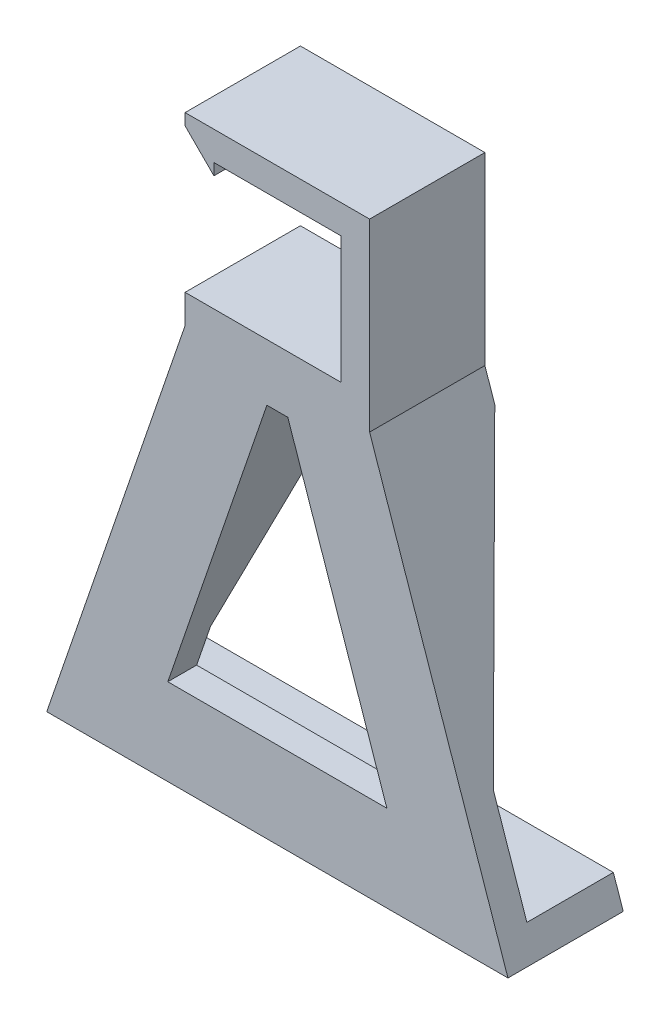
ISO-10303-21;
HEADER;
FILE_DESCRIPTION(('STEP AP214'),'2;1');
FILE_NAME('part.step','',(''),(''),'','','');
FILE_SCHEMA(('AUTOMOTIVE_DESIGN { 1 0 10303 214 1 1 1 1 }'));
ENDSEC;
DATA;
#1=APPLICATION_CONTEXT('core data for automotive mechanical design processes');
#2=APPLICATION_PROTOCOL_DEFINITION('international standard','automotive_design',2000,#1);
#3=PRODUCT_CONTEXT('',#1,'mechanical');
#4=PRODUCT('Part','Part','',(#3));
#5=PRODUCT_RELATED_PRODUCT_CATEGORY('part','',(#4));
#6=PRODUCT_DEFINITION_FORMATION('','',#4);
#7=PRODUCT_DEFINITION_CONTEXT('part definition',#1,'design');
#8=PRODUCT_DEFINITION('design','',#6,#7);
#9=PRODUCT_DEFINITION_SHAPE('','',#8);
#10=(LENGTH_UNIT() NAMED_UNIT(*) SI_UNIT(.MILLI.,.METRE.));
#11=(NAMED_UNIT(*) PLANE_ANGLE_UNIT() SI_UNIT($,.RADIAN.));
#12=(NAMED_UNIT(*) SI_UNIT($,.STERADIAN.) SOLID_ANGLE_UNIT());
#13=UNCERTAINTY_MEASURE_WITH_UNIT(LENGTH_MEASURE(1.E-05),#10,'distance_accuracy_value','');
#14=(GEOMETRIC_REPRESENTATION_CONTEXT(3) GLOBAL_UNCERTAINTY_ASSIGNED_CONTEXT((#13)) GLOBAL_UNIT_ASSIGNED_CONTEXT((#10,
#11,#12)) REPRESENTATION_CONTEXT('',''));
#15=CARTESIAN_POINT('',(0.,0.,0.));
#16=DIRECTION('',(0.,0.,1.));
#17=DIRECTION('',(1.,0.,0.));
#18=AXIS2_PLACEMENT_3D('',#15,#16,#17);
#19=CARTESIAN_POINT('',(0.,0.,20.));
#20=DIRECTION('',(0.,0.,1.));
#21=DIRECTION('',(1.,0.,0.));
#22=AXIS2_PLACEMENT_3D('',#19,#20,#21);
#23=PLANE('',#22);
#24=DIRECTION('',(0.,-1.,0.));
#25=VECTOR('',#24,1.);
#26=CARTESIAN_POINT('',(11.,11.,20.));
#27=LINE('',#26,#25);
#28=CARTESIAN_POINT('',(11.,11.,20.));
#29=VERTEX_POINT('',#28);
#30=CARTESIAN_POINT('',(11.,-11.,20.));
#31=VERTEX_POINT('',#30);
#32=EDGE_CURVE('E375',#29,#31,#27,.T.);
#33=ORIENTED_EDGE('',*,*,#32,.T.);
#34=DIRECTION('',(-1.,0.,0.));
#35=VECTOR('',#34,1.);
#36=CARTESIAN_POINT('',(-11.,-11.,20.));
#37=LINE('',#36,#35);
#38=CARTESIAN_POINT('',(-16.,-11.,20.));
#39=VERTEX_POINT('',#38);
#40=EDGE_CURVE('E383',#31,#39,#37,.T.);
#41=ORIENTED_EDGE('',*,*,#40,.T.);
#42=DIRECTION('',(0.,-1.,0.));
#43=VECTOR('',#42,1.);
#44=CARTESIAN_POINT('',(-16.,-11.,20.));
#45=LINE('',#44,#43);
#46=CARTESIAN_POINT('',(-16.,-16.,20.));
#47=VERTEX_POINT('',#46);
#48=EDGE_CURVE('E386',#39,#47,#45,.T.);
#49=ORIENTED_EDGE('',*,*,#48,.T.);
#50=DIRECTION('',(-0.324324324324324,-0.945945945945946,0.));
#51=VECTOR('',#50,1.);
#52=CARTESIAN_POINT('',(-16.,-16.,20.));
#53=LINE('',#52,#51);
#54=CARTESIAN_POINT('',(-40.,-86.,20.));
#55=VERTEX_POINT('',#54);
#56=EDGE_CURVE('E258',#47,#55,#53,.T.);
#57=ORIENTED_EDGE('',*,*,#56,.T.);
#58=DIRECTION('',(-1.,0.,0.));
#59=VECTOR('',#58,1.);
#60=CARTESIAN_POINT('',(-40.,-86.,20.));
#61=LINE('',#60,#59);
#62=CARTESIAN_POINT('',(40.,-86.,20.));
#63=VERTEX_POINT('',#62);
#64=EDGE_CURVE('E365',#63,#55,#61,.T.);
#65=ORIENTED_EDGE('',*,*,#64,.F.);
#66=DIRECTION('',(0.324324324324324,-0.945945945945946,0.));
#67=VECTOR('',#66,1.);
#68=CARTESIAN_POINT('',(16.,-16.,20.));
#69=LINE('',#68,#67);
#70=CARTESIAN_POINT('',(16.,-16.,20.));
#71=VERTEX_POINT('',#70);
#72=EDGE_CURVE('E259',#71,#63,#69,.T.);
#73=ORIENTED_EDGE('',*,*,#72,.F.);
#74=DIRECTION('',(0.,1.,0.));
#75=VECTOR('',#74,1.);
#76=CARTESIAN_POINT('',(16.,16.,20.));
#77=LINE('',#76,#75);
#78=CARTESIAN_POINT('',(16.,16.,20.));
#79=VERTEX_POINT('',#78);
#80=EDGE_CURVE('E390',#71,#79,#77,.T.);
#81=ORIENTED_EDGE('',*,*,#80,.T.);
#82=DIRECTION('',(-1.,0.,0.));
#83=VECTOR('',#82,1.);
#84=CARTESIAN_POINT('',(-16.,16.,20.));
#85=LINE('',#84,#83);
#86=CARTESIAN_POINT('',(-16.,16.,20.));
#87=VERTEX_POINT('',#86);
#88=EDGE_CURVE('E387',#79,#87,#85,.T.);
#89=ORIENTED_EDGE('',*,*,#88,.T.);
#90=DIRECTION('',(0.,-1.,0.));
#91=VECTOR('',#90,1.);
#92=CARTESIAN_POINT('',(-16.,16.,20.));
#93=LINE('',#92,#91);
#94=CARTESIAN_POINT('',(-16.,14.,20.));
#95=VERTEX_POINT('',#94);
#96=EDGE_CURVE('E389',#87,#95,#93,.T.);
#97=ORIENTED_EDGE('',*,*,#96,.T.);
#98=DIRECTION('',(0.707106781186544,-0.707106781186551,0.));
#99=VECTOR('',#98,1.);
#100=CARTESIAN_POINT('',(-11.,9.,20.));
#101=LINE('',#100,#99);
#102=CARTESIAN_POINT('',(-11.,9.,20.));
#103=VERTEX_POINT('',#102);
#104=EDGE_CURVE('E392',#95,#103,#101,.T.);
#105=ORIENTED_EDGE('',*,*,#104,.T.);
#106=DIRECTION('',(0.,1.,0.));
#107=VECTOR('',#106,1.);
#108=CARTESIAN_POINT('',(-11.,11.,20.));
#109=LINE('',#108,#107);
#110=CARTESIAN_POINT('',(-11.,11.,20.));
#111=VERTEX_POINT('',#110);
#112=EDGE_CURVE('E394',#103,#111,#109,.T.);
#113=ORIENTED_EDGE('',*,*,#112,.T.);
#114=DIRECTION('',(1.,0.,0.));
#115=VECTOR('',#114,1.);
#116=CARTESIAN_POINT('',(-11.,11.,20.));
#117=LINE('',#116,#115);
#118=EDGE_CURVE('E396',#111,#29,#117,.T.);
#119=ORIENTED_EDGE('',*,*,#118,.T.);
#120=EDGE_LOOP('',(#33,#41,#49,#57,#65,#73,#81,#89,#97,#105,#113,#119));
#121=FACE_BOUND('',#120,.T.);
#122=DIRECTION('',(0.324324324324324,-0.945945945945946,0.));
#123=VECTOR('',#122,1.);
#124=CARTESIAN_POINT('',(-4.7808619430241,-1.63915266617969,20.));
#125=LINE('',#124,#123);
#126=CARTESIAN_POINT('',(1.81081081081082,-20.8648648648649,20.));
#127=VERTEX_POINT('',#126);
#128=CARTESIAN_POINT('',(19.,-71.,20.));
#129=VERTEX_POINT('',#128);
#130=EDGE_CURVE('E200',#127,#129,#125,.T.);
#131=ORIENTED_EDGE('',*,*,#130,.T.);
#132=DIRECTION('',(-1.,0.,0.));
#133=VECTOR('',#132,1.);
#134=CARTESIAN_POINT('',(0.,-71.,20.));
#135=LINE('',#134,#133);
#136=CARTESIAN_POINT('',(-19.,-71.,20.));
#137=VERTEX_POINT('',#136);
#138=EDGE_CURVE('E231',#129,#137,#135,.T.);
#139=ORIENTED_EDGE('',*,*,#138,.T.);
#140=DIRECTION('',(0.324324324324324,0.945945945945946,0.));
#141=VECTOR('',#140,1.);
#142=CARTESIAN_POINT('',(4.78086194302411,-1.63915266617969,20.));
#143=LINE('',#142,#141);
#144=CARTESIAN_POINT('',(-1.81081081081081,-20.8648648648649,20.));
#145=VERTEX_POINT('',#144);
#146=EDGE_CURVE('E225',#137,#145,#143,.T.);
#147=ORIENTED_EDGE('',*,*,#146,.T.);
#148=DIRECTION('',(1.,0.,0.));
#149=VECTOR('',#148,1.);
#150=CARTESIAN_POINT('',(0.,-20.8648648648649,20.));
#151=LINE('',#150,#149);
#152=EDGE_CURVE('E234',#145,#127,#151,.T.);
#153=ORIENTED_EDGE('',*,*,#152,.T.);
#154=EDGE_LOOP('',(#131,#139,#147,#153));
#155=FACE_BOUND('',#154,.T.);
#156=ADVANCED_FACE('F45',(#121,#155),#23,.T.);
#157=CARTESIAN_POINT('',(0.,0.,0.));
#158=DIRECTION('',(0.,0.,1.));
#159=DIRECTION('',(1.,0.,0.));
#160=AXIS2_PLACEMENT_3D('',#157,#158,#159);
#161=PLANE('',#160);
#162=DIRECTION('',(-0.324324324324324,0.945945945945946,0.));
#163=VECTOR('',#162,1.);
#164=CARTESIAN_POINT('',(1.81081081081082,-20.8648648648649,0.));
#165=LINE('',#164,#163);
#166=CARTESIAN_POINT('',(1.85714285714287,-21.,0.));
#167=VERTEX_POINT('',#166);
#168=CARTESIAN_POINT('',(1.81081081081082,-20.8648648648649,0.));
#169=VERTEX_POINT('',#168);
#170=EDGE_CURVE('E196',#167,#169,#165,.T.);
#171=ORIENTED_EDGE('',*,*,#170,.T.);
#172=DIRECTION('',(-1.,0.,0.));
#173=VECTOR('',#172,1.);
#174=CARTESIAN_POINT('',(-1.81081081081081,-20.8648648648649,0.));
#175=LINE('',#174,#173);
#176=CARTESIAN_POINT('',(-1.81081081081081,-20.8648648648649,0.));
#177=VERTEX_POINT('',#176);
#178=EDGE_CURVE('E206',#169,#177,#175,.T.);
#179=ORIENTED_EDGE('',*,*,#178,.T.);
#180=DIRECTION('',(-0.324324324324324,-0.945945945945946,0.));
#181=VECTOR('',#180,1.);
#182=CARTESIAN_POINT('',(-19.,-71.,0.));
#183=LINE('',#182,#181);
#184=CARTESIAN_POINT('',(-1.85714285714286,-21.,0.));
#185=VERTEX_POINT('',#184);
#186=EDGE_CURVE('E210',#177,#185,#183,.T.);
#187=ORIENTED_EDGE('',*,*,#186,.T.);
#188=DIRECTION('',(1.,0.,0.));
#189=VECTOR('',#188,1.);
#190=CARTESIAN_POINT('',(-40.0001,-21.,0.));
#191=LINE('',#190,#189);
#192=CARTESIAN_POINT('',(-17.7142857142857,-21.,0.));
#193=VERTEX_POINT('',#192);
#194=EDGE_CURVE('E247',#193,#185,#191,.T.);
#195=ORIENTED_EDGE('',*,*,#194,.F.);
#196=DIRECTION('',(-0.324324324324324,-0.945945945945946,0.));
#197=VECTOR('',#196,1.);
#198=CARTESIAN_POINT('',(-16.,-16.,0.));
#199=LINE('',#198,#197);
#200=CARTESIAN_POINT('',(-16.,-16.,0.));
#201=VERTEX_POINT('',#200);
#202=EDGE_CURVE('E269',#201,#193,#199,.T.);
#203=ORIENTED_EDGE('',*,*,#202,.F.);
#204=DIRECTION('',(0.,-1.,0.));
#205=VECTOR('',#204,1.);
#206=CARTESIAN_POINT('',(-16.,-11.,0.));
#207=LINE('',#206,#205);
#208=CARTESIAN_POINT('',(-16.,-11.,0.));
#209=VERTEX_POINT('',#208);
#210=EDGE_CURVE('E403',#209,#201,#207,.T.);
#211=ORIENTED_EDGE('',*,*,#210,.F.);
#212=DIRECTION('',(-1.,0.,0.));
#213=VECTOR('',#212,1.);
#214=CARTESIAN_POINT('',(-11.,-11.,0.));
#215=LINE('',#214,#213);
#216=CARTESIAN_POINT('',(11.,-11.,0.));
#217=VERTEX_POINT('',#216);
#218=EDGE_CURVE('E401',#217,#209,#215,.T.);
#219=ORIENTED_EDGE('',*,*,#218,.F.);
#220=DIRECTION('',(0.,-1.,0.));
#221=VECTOR('',#220,1.);
#222=CARTESIAN_POINT('',(11.,11.,0.));
#223=LINE('',#222,#221);
#224=CARTESIAN_POINT('',(11.,11.,0.));
#225=VERTEX_POINT('',#224);
#226=EDGE_CURVE('E347',#225,#217,#223,.T.);
#227=ORIENTED_EDGE('',*,*,#226,.F.);
#228=DIRECTION('',(1.,0.,0.));
#229=VECTOR('',#228,1.);
#230=CARTESIAN_POINT('',(-11.,11.,0.));
#231=LINE('',#230,#229);
#232=CARTESIAN_POINT('',(-11.,11.,0.));
#233=VERTEX_POINT('',#232);
#234=EDGE_CURVE('E384',#233,#225,#231,.T.);
#235=ORIENTED_EDGE('',*,*,#234,.F.);
#236=DIRECTION('',(0.,1.,0.));
#237=VECTOR('',#236,1.);
#238=CARTESIAN_POINT('',(-11.,11.,0.));
#239=LINE('',#238,#237);
#240=CARTESIAN_POINT('',(-11.,9.,0.));
#241=VERTEX_POINT('',#240);
#242=EDGE_CURVE('E411',#241,#233,#239,.T.);
#243=ORIENTED_EDGE('',*,*,#242,.F.);
#244=DIRECTION('',(0.707106781186544,-0.707106781186551,0.));
#245=VECTOR('',#244,1.);
#246=CARTESIAN_POINT('',(-11.,9.,0.));
#247=LINE('',#246,#245);
#248=CARTESIAN_POINT('',(-16.,14.,0.));
#249=VERTEX_POINT('',#248);
#250=EDGE_CURVE('E409',#249,#241,#247,.T.);
#251=ORIENTED_EDGE('',*,*,#250,.F.);
#252=DIRECTION('',(0.,-1.,0.));
#253=VECTOR('',#252,1.);
#254=CARTESIAN_POINT('',(-16.,16.,0.));
#255=LINE('',#254,#253);
#256=CARTESIAN_POINT('',(-16.,16.,0.));
#257=VERTEX_POINT('',#256);
#258=EDGE_CURVE('E406',#257,#249,#255,.T.);
#259=ORIENTED_EDGE('',*,*,#258,.F.);
#260=DIRECTION('',(-1.,0.,0.));
#261=VECTOR('',#260,1.);
#262=CARTESIAN_POINT('',(-16.,16.,0.));
#263=LINE('',#262,#261);
#264=CARTESIAN_POINT('',(16.,16.,0.));
#265=VERTEX_POINT('',#264);
#266=EDGE_CURVE('E404',#265,#257,#263,.T.);
#267=ORIENTED_EDGE('',*,*,#266,.F.);
#268=DIRECTION('',(0.,1.,0.));
#269=VECTOR('',#268,1.);
#270=CARTESIAN_POINT('',(16.,16.,0.));
#271=LINE('',#270,#269);
#272=CARTESIAN_POINT('',(16.,-16.,0.));
#273=VERTEX_POINT('',#272);
#274=EDGE_CURVE('E407',#273,#265,#271,.T.);
#275=ORIENTED_EDGE('',*,*,#274,.F.);
#276=DIRECTION('',(0.324324324324324,-0.945945945945946,0.));
#277=VECTOR('',#276,1.);
#278=CARTESIAN_POINT('',(16.,-16.,0.));
#279=LINE('',#278,#277);
#280=CARTESIAN_POINT('',(17.7142857142857,-21.,0.));
#281=VERTEX_POINT('',#280);
#282=EDGE_CURVE('E275',#273,#281,#279,.T.);
#283=ORIENTED_EDGE('',*,*,#282,.T.);
#284=EDGE_CURVE('E215',#167,#281,#191,.T.);
#285=ORIENTED_EDGE('',*,*,#284,.F.);
#286=EDGE_LOOP('',(#171,#179,#187,#195,#203,#211,#219,#227,#235,#243,#251,#259,#267,#275,#283,#285));
#287=FACE_BOUND('',#286,.T.);
#288=ADVANCED_FACE('F213',(#287),#161,.F.);
#289=CARTESIAN_POINT('',(-40.0001,-81.,15.));
#290=DIRECTION('',(0.,0.,1.));
#291=DIRECTION('',(1.,0.,0.));
#292=AXIS2_PLACEMENT_3D('',#289,#290,#291);
#293=PLANE('',#292);
#294=DIRECTION('',(0.324324324324324,-0.945945945945946,0.));
#295=VECTOR('',#294,1.);
#296=CARTESIAN_POINT('',(15.8619325054785,-61.8473031409788,15.));
#297=LINE('',#296,#295);
#298=CARTESIAN_POINT('',(16.6,-64.,15.));
#299=VERTEX_POINT('',#298);
#300=CARTESIAN_POINT('',(19.,-71.,15.));
#301=VERTEX_POINT('',#300);
#302=EDGE_CURVE('E228',#299,#301,#297,.T.);
#303=ORIENTED_EDGE('',*,*,#302,.F.);
#304=DIRECTION('',(1.,0.,0.));
#305=VECTOR('',#304,1.);
#306=CARTESIAN_POINT('',(-40.0001,-64.,15.));
#307=LINE('',#306,#305);
#308=CARTESIAN_POINT('',(32.4571428571429,-64.,15.));
#309=VERTEX_POINT('',#308);
#310=EDGE_CURVE('E246',#299,#309,#307,.T.);
#311=ORIENTED_EDGE('',*,*,#310,.T.);
#312=DIRECTION('',(-0.324324324324324,0.945945945945946,0.));
#313=VECTOR('',#312,1.);
#314=CARTESIAN_POINT('',(9.40832724616508,3.22571219868517,15.));
#315=LINE('',#314,#313);
#316=CARTESIAN_POINT('',(38.2857142857143,-81.,15.));
#317=VERTEX_POINT('',#316);
#318=EDGE_CURVE('E252',#317,#309,#315,.T.);
#319=ORIENTED_EDGE('',*,*,#318,.F.);
#320=DIRECTION('',(1.,0.,0.));
#321=VECTOR('',#320,1.);
#322=CARTESIAN_POINT('',(-40.0001,-81.,15.));
#323=LINE('',#322,#321);
#324=CARTESIAN_POINT('',(-38.2857142857143,-81.,15.));
#325=VERTEX_POINT('',#324);
#326=EDGE_CURVE('E240',#325,#317,#323,.T.);
#327=ORIENTED_EDGE('',*,*,#326,.F.);
#328=DIRECTION('',(-0.324324324324324,-0.945945945945946,0.));
#329=VECTOR('',#328,1.);
#330=CARTESIAN_POINT('',(-9.40832724616509,3.22571219868517,15.));
#331=LINE('',#330,#329);
#332=CARTESIAN_POINT('',(-32.4571428571429,-64.,15.));
#333=VERTEX_POINT('',#332);
#334=EDGE_CURVE('E286',#333,#325,#331,.T.);
#335=ORIENTED_EDGE('',*,*,#334,.F.);
#336=CARTESIAN_POINT('',(-16.6,-64.,15.));
#337=VERTEX_POINT('',#336);
#338=EDGE_CURVE('E243',#333,#337,#307,.T.);
#339=ORIENTED_EDGE('',*,*,#338,.T.);
#340=DIRECTION('',(0.324324324324324,0.945945945945946,0.));
#341=VECTOR('',#340,1.);
#342=CARTESIAN_POINT('',(-24.2768549306063,-86.390826880935,15.));
#343=LINE('',#342,#341);
#344=CARTESIAN_POINT('',(-19.,-71.,15.));
#345=VERTEX_POINT('',#344);
#346=EDGE_CURVE('E67',#345,#337,#343,.T.);
#347=ORIENTED_EDGE('',*,*,#346,.F.);
#348=DIRECTION('',(-1.,0.,0.));
#349=VECTOR('',#348,1.);
#350=CARTESIAN_POINT('',(-40.0001,-71.,15.));
#351=LINE('',#350,#349);
#352=EDGE_CURVE('E12',#301,#345,#351,.T.);
#353=ORIENTED_EDGE('',*,*,#352,.F.);
#354=EDGE_LOOP('',(#303,#311,#319,#327,#335,#339,#347,#353));
#355=FACE_BOUND('',#354,.T.);
#356=ADVANCED_FACE('F460',(#355),#293,.F.);
#357=CARTESIAN_POINT('',(-40.0001,-64.,15.));
#358=DIRECTION('',(0.,0.329372156318294,0.944200181445776));
#359=DIRECTION('',(0.,-0.944200181445776,0.329372156318294));
#360=AXIS2_PLACEMENT_3D('',#357,#358,#359);
#361=PLANE('',#360);
#362=DIRECTION('',(0.307989398192032,-0.898302411393428,0.313361306300033));
#363=VECTOR('',#362,1.);
#364=CARTESIAN_POINT('',(11.2310577462872,-48.3405850933377,9.53741340465267));
#365=LINE('',#364,#363);
#366=EDGE_CURVE('E53',#167,#299,#365,.T.);
#367=ORIENTED_EDGE('',*,*,#366,.F.);
#368=ORIENTED_EDGE('',*,*,#284,.T.);
#369=DIRECTION('',(-0.307989398192032,0.898302411393428,-0.313361306300033));
#370=VECTOR('',#369,1.);
#371=CARTESIAN_POINT('',(10.2239333985534,0.846860920885839,-7.62099799565786));
#372=LINE('',#371,#370);
#373=EDGE_CURVE('E239',#309,#281,#372,.T.);
#374=ORIENTED_EDGE('',*,*,#373,.F.);
#375=ORIENTED_EDGE('',*,*,#310,.F.);
#376=EDGE_LOOP('',(#367,#368,#374,#375));
#377=FACE_BOUND('',#376,.T.);
#378=ADVANCED_FACE('F321',(#377),#361,.F.);
#379=DIRECTION('',(0.307989398192032,0.898302411393428,-0.313361306300033));
#380=VECTOR('',#379,1.);
#381=CARTESIAN_POINT('',(-18.8196742696763,-70.4740499532225,17.258389518566));
#382=LINE('',#381,#380);
#383=EDGE_CURVE('E293',#337,#185,#382,.T.);
#384=ORIENTED_EDGE('',*,*,#383,.F.);
#385=ORIENTED_EDGE('',*,*,#338,.F.);
#386=DIRECTION('',(-0.307989398192032,-0.898302411393427,0.313361306300033));
#387=VECTOR('',#386,1.);
#388=CARTESIAN_POINT('',(-10.2239333985534,0.846860920885839,-7.62099799565786));
#389=LINE('',#388,#387);
#390=EDGE_CURVE('E283',#193,#333,#389,.T.);
#391=ORIENTED_EDGE('',*,*,#390,.F.);
#392=ORIENTED_EDGE('',*,*,#194,.T.);
#393=EDGE_LOOP('',(#384,#385,#391,#392));
#394=FACE_BOUND('',#393,.T.);
#395=ADVANCED_FACE('F490',(#394),#361,.F.);
#396=CARTESIAN_POINT('',(-38.2857142857143,-81.,0.));
#397=VERTEX_POINT('',#396);
#398=CARTESIAN_POINT('',(-40.,-86.,0.));
#399=VERTEX_POINT('',#398);
#400=EDGE_CURVE('E262',#397,#399,#199,.T.);
#401=ORIENTED_EDGE('',*,*,#400,.F.);
#402=DIRECTION('',(1.,0.,0.));
#403=VECTOR('',#402,1.);
#404=CARTESIAN_POINT('',(-40.0001,-81.,0.));
#405=LINE('',#404,#403);
#406=CARTESIAN_POINT('',(38.2857142857143,-81.,0.));
#407=VERTEX_POINT('',#406);
#408=EDGE_CURVE('E236',#397,#407,#405,.T.);
#409=ORIENTED_EDGE('',*,*,#408,.T.);
#410=CARTESIAN_POINT('',(40.,-86.,0.));
#411=VERTEX_POINT('',#410);
#412=EDGE_CURVE('E272',#407,#411,#279,.T.);
#413=ORIENTED_EDGE('',*,*,#412,.T.);
#414=DIRECTION('',(1.,0.,0.));
#415=VECTOR('',#414,1.);
#416=CARTESIAN_POINT('',(-40.,-86.,0.));
#417=LINE('',#416,#415);
#418=EDGE_CURVE('E343',#399,#411,#417,.T.);
#419=ORIENTED_EDGE('',*,*,#418,.F.);
#420=EDGE_LOOP('',(#401,#409,#413,#419));
#421=FACE_BOUND('',#420,.T.);
#422=ADVANCED_FACE('F461',(#421),#161,.F.);
#423=CARTESIAN_POINT('',(11.,11.,20.));
#424=DIRECTION('',(1.,0.,0.));
#425=DIRECTION('',(0.,1.,0.));
#426=AXIS2_PLACEMENT_3D('',#423,#424,#425);
#427=PLANE('',#426);
#428=ORIENTED_EDGE('',*,*,#226,.T.);
#429=DIRECTION('',(0.,0.,-1.));
#430=VECTOR('',#429,1.);
#431=CARTESIAN_POINT('',(11.,-11.,20.));
#432=LINE('',#431,#430);
#433=EDGE_CURVE('E287',#31,#217,#432,.T.);
#434=ORIENTED_EDGE('',*,*,#433,.F.);
#435=ORIENTED_EDGE('',*,*,#32,.F.);
#436=DIRECTION('',(0.,0.,-1.));
#437=VECTOR('',#436,1.);
#438=CARTESIAN_POINT('',(11.,11.,20.));
#439=LINE('',#438,#437);
#440=EDGE_CURVE('E398',#29,#225,#439,.T.);
#441=ORIENTED_EDGE('',*,*,#440,.T.);
#442=EDGE_LOOP('',(#428,#434,#435,#441));
#443=FACE_BOUND('',#442,.T.);
#444=ADVANCED_FACE('F47',(#443),#427,.F.);
#445=CARTESIAN_POINT('',(-11.,-11.,20.));
#446=DIRECTION('',(0.,-1.,0.));
#447=DIRECTION('',(0.,0.,-1.));
#448=AXIS2_PLACEMENT_3D('',#445,#446,#447);
#449=PLANE('',#448);
#450=ORIENTED_EDGE('',*,*,#218,.T.);
#451=DIRECTION('',(0.,0.,-1.));
#452=VECTOR('',#451,1.);
#453=CARTESIAN_POINT('',(-16.,-11.,20.));
#454=LINE('',#453,#452);
#455=EDGE_CURVE('E431',#39,#209,#454,.T.);
#456=ORIENTED_EDGE('',*,*,#455,.F.);
#457=ORIENTED_EDGE('',*,*,#40,.F.);
#458=ORIENTED_EDGE('',*,*,#433,.T.);
#459=EDGE_LOOP('',(#450,#456,#457,#458));
#460=FACE_BOUND('',#459,.T.);
#461=ADVANCED_FACE('F499',(#460),#449,.F.);
#462=CARTESIAN_POINT('',(-16.,-11.,20.));
#463=DIRECTION('',(1.,0.,0.));
#464=DIRECTION('',(0.,0.,-1.));
#465=AXIS2_PLACEMENT_3D('',#462,#463,#464);
#466=PLANE('',#465);
#467=ORIENTED_EDGE('',*,*,#210,.T.);
#468=DIRECTION('',(0.,0.,1.));
#469=VECTOR('',#468,1.);
#470=CARTESIAN_POINT('',(-16.,-16.,0.));
#471=LINE('',#470,#469);
#472=EDGE_CURVE('E434',#47,#201,#471,.F.);
#473=ORIENTED_EDGE('',*,*,#472,.F.);
#474=ORIENTED_EDGE('',*,*,#48,.F.);
#475=ORIENTED_EDGE('',*,*,#455,.T.);
#476=EDGE_LOOP('',(#467,#473,#474,#475));
#477=FACE_BOUND('',#476,.T.);
#478=ADVANCED_FACE('F495',(#477),#466,.F.);
#479=CARTESIAN_POINT('',(16.,16.,20.));
#480=DIRECTION('',(-1.,0.,0.));
#481=DIRECTION('',(0.,-1.,0.));
#482=AXIS2_PLACEMENT_3D('',#479,#480,#481);
#483=PLANE('',#482);
#484=ORIENTED_EDGE('',*,*,#274,.T.);
#485=DIRECTION('',(0.,0.,-1.));
#486=VECTOR('',#485,1.);
#487=CARTESIAN_POINT('',(16.,16.,20.));
#488=LINE('',#487,#486);
#489=EDGE_CURVE('E428',#79,#265,#488,.T.);
#490=ORIENTED_EDGE('',*,*,#489,.F.);
#491=ORIENTED_EDGE('',*,*,#80,.F.);
#492=DIRECTION('',(0.,0.,1.));
#493=VECTOR('',#492,1.);
#494=CARTESIAN_POINT('',(16.,-16.,20.));
#495=LINE('',#494,#493);
#496=EDGE_CURVE('E281',#71,#273,#495,.F.);
#497=ORIENTED_EDGE('',*,*,#496,.T.);
#498=EDGE_LOOP('',(#484,#490,#491,#497));
#499=FACE_BOUND('',#498,.T.);
#500=ADVANCED_FACE('F478',(#499),#483,.F.);
#501=CARTESIAN_POINT('',(-16.,16.,20.));
#502=DIRECTION('',(0.,-1.,0.));
#503=DIRECTION('',(0.,0.,-1.));
#504=AXIS2_PLACEMENT_3D('',#501,#502,#503);
#505=PLANE('',#504);
#506=ORIENTED_EDGE('',*,*,#266,.T.);
#507=DIRECTION('',(0.,0.,-1.));
#508=VECTOR('',#507,1.);
#509=CARTESIAN_POINT('',(-16.,16.,20.));
#510=LINE('',#509,#508);
#511=EDGE_CURVE('E425',#87,#257,#510,.T.);
#512=ORIENTED_EDGE('',*,*,#511,.F.);
#513=ORIENTED_EDGE('',*,*,#88,.F.);
#514=ORIENTED_EDGE('',*,*,#489,.T.);
#515=EDGE_LOOP('',(#506,#512,#513,#514));
#516=FACE_BOUND('',#515,.T.);
#517=ADVANCED_FACE('F524',(#516),#505,.F.);
#518=CARTESIAN_POINT('',(-16.,16.,20.));
#519=DIRECTION('',(1.,0.,0.));
#520=DIRECTION('',(0.,0.,-1.));
#521=AXIS2_PLACEMENT_3D('',#518,#519,#520);
#522=PLANE('',#521);
#523=ORIENTED_EDGE('',*,*,#258,.T.);
#524=DIRECTION('',(0.,0.,-1.));
#525=VECTOR('',#524,1.);
#526=CARTESIAN_POINT('',(-16.,14.,20.));
#527=LINE('',#526,#525);
#528=EDGE_CURVE('E422',#95,#249,#527,.T.);
#529=ORIENTED_EDGE('',*,*,#528,.F.);
#530=ORIENTED_EDGE('',*,*,#96,.F.);
#531=ORIENTED_EDGE('',*,*,#511,.T.);
#532=EDGE_LOOP('',(#523,#529,#530,#531));
#533=FACE_BOUND('',#532,.T.);
#534=ADVANCED_FACE('F519',(#533),#522,.F.);
#535=CARTESIAN_POINT('',(-11.,9.,20.));
#536=DIRECTION('',(0.707106781186551,0.707106781186544,0.));
#537=DIRECTION('',(-0.707106781186544,0.707106781186551,0.));
#538=AXIS2_PLACEMENT_3D('',#535,#536,#537);
#539=PLANE('',#538);
#540=ORIENTED_EDGE('',*,*,#250,.T.);
#541=DIRECTION('',(0.,0.,-1.));
#542=VECTOR('',#541,1.);
#543=CARTESIAN_POINT('',(-11.,9.,20.));
#544=LINE('',#543,#542);
#545=EDGE_CURVE('E419',#103,#241,#544,.T.);
#546=ORIENTED_EDGE('',*,*,#545,.F.);
#547=ORIENTED_EDGE('',*,*,#104,.F.);
#548=ORIENTED_EDGE('',*,*,#528,.T.);
#549=EDGE_LOOP('',(#540,#546,#547,#548));
#550=FACE_BOUND('',#549,.T.);
#551=ADVANCED_FACE('F516',(#550),#539,.F.);
#552=CARTESIAN_POINT('',(-11.,11.,20.));
#553=DIRECTION('',(-1.,0.,0.));
#554=DIRECTION('',(0.,-1.,0.));
#555=AXIS2_PLACEMENT_3D('',#552,#553,#554);
#556=PLANE('',#555);
#557=ORIENTED_EDGE('',*,*,#242,.T.);
#558=DIRECTION('',(0.,0.,-1.));
#559=VECTOR('',#558,1.);
#560=CARTESIAN_POINT('',(-11.,11.,20.));
#561=LINE('',#560,#559);
#562=EDGE_CURVE('E416',#111,#233,#561,.T.);
#563=ORIENTED_EDGE('',*,*,#562,.F.);
#564=ORIENTED_EDGE('',*,*,#112,.F.);
#565=ORIENTED_EDGE('',*,*,#545,.T.);
#566=EDGE_LOOP('',(#557,#563,#564,#565));
#567=FACE_BOUND('',#566,.T.);
#568=ADVANCED_FACE('F512',(#567),#556,.F.);
#569=CARTESIAN_POINT('',(-11.,11.,20.));
#570=DIRECTION('',(0.,1.,0.));
#571=DIRECTION('',(0.,0.,1.));
#572=AXIS2_PLACEMENT_3D('',#569,#570,#571);
#573=PLANE('',#572);
#574=ORIENTED_EDGE('',*,*,#234,.T.);
#575=ORIENTED_EDGE('',*,*,#440,.F.);
#576=ORIENTED_EDGE('',*,*,#118,.F.);
#577=ORIENTED_EDGE('',*,*,#562,.T.);
#578=EDGE_LOOP('',(#574,#575,#576,#577));
#579=FACE_BOUND('',#578,.T.);
#580=ADVANCED_FACE('F462',(#579),#573,.F.);
#581=CARTESIAN_POINT('',(0.,-86.,0.));
#582=DIRECTION('',(0.,1.,0.));
#583=DIRECTION('',(0.,0.,1.));
#584=AXIS2_PLACEMENT_3D('',#581,#582,#583);
#585=PLANE('',#584);
#586=DIRECTION('',(0.,0.,-1.));
#587=VECTOR('',#586,1.);
#588=CARTESIAN_POINT('',(-40.,-86.,0.));
#589=LINE('',#588,#587);
#590=EDGE_CURVE('E340',#55,#399,#589,.T.);
#591=ORIENTED_EDGE('',*,*,#590,.T.);
#592=ORIENTED_EDGE('',*,*,#418,.T.);
#593=DIRECTION('',(0.,0.,1.));
#594=VECTOR('',#593,1.);
#595=CARTESIAN_POINT('',(40.,-86.,0.));
#596=LINE('',#595,#594);
#597=EDGE_CURVE('E302',#411,#63,#596,.T.);
#598=ORIENTED_EDGE('',*,*,#597,.T.);
#599=ORIENTED_EDGE('',*,*,#64,.T.);
#600=EDGE_LOOP('',(#591,#592,#598,#599));
#601=FACE_BOUND('',#600,.T.);
#602=ADVANCED_FACE('F320',(#601),#585,.F.);
#603=CARTESIAN_POINT('',(9.40832724616508,3.22571219868517,0.));
#604=DIRECTION('',(-0.945945945945946,-0.324324324324324,0.));
#605=DIRECTION('',(0.324324324324324,-0.945945945945946,0.));
#606=AXIS2_PLACEMENT_3D('',#603,#604,#605);
#607=PLANE('',#606);
#608=ORIENTED_EDGE('',*,*,#412,.F.);
#609=DIRECTION('',(0.,0.,1.));
#610=VECTOR('',#609,1.);
#611=CARTESIAN_POINT('',(38.2857142857143,-81.,0.));
#612=LINE('',#611,#610);
#613=EDGE_CURVE('E255',#407,#317,#612,.T.);
#614=ORIENTED_EDGE('',*,*,#613,.T.);
#615=ORIENTED_EDGE('',*,*,#318,.T.);
#616=ORIENTED_EDGE('',*,*,#373,.T.);
#617=ORIENTED_EDGE('',*,*,#282,.F.);
#618=ORIENTED_EDGE('',*,*,#496,.F.);
#619=ORIENTED_EDGE('',*,*,#72,.T.);
#620=ORIENTED_EDGE('',*,*,#597,.F.);
#621=EDGE_LOOP('',(#608,#614,#615,#616,#617,#618,#619,#620));
#622=FACE_BOUND('',#621,.T.);
#623=ADVANCED_FACE('F309',(#622),#607,.F.);
#624=CARTESIAN_POINT('',(-9.40832724616509,3.22571219868517,0.));
#625=DIRECTION('',(0.945945945945946,-0.324324324324324,0.));
#626=DIRECTION('',(0.324324324324324,0.945945945945946,0.));
#627=AXIS2_PLACEMENT_3D('',#624,#625,#626);
#628=PLANE('',#627);
#629=ORIENTED_EDGE('',*,*,#334,.T.);
#630=DIRECTION('',(0.,0.,-1.));
#631=VECTOR('',#630,1.);
#632=CARTESIAN_POINT('',(-38.2857142857143,-81.,0.));
#633=LINE('',#632,#631);
#634=EDGE_CURVE('E290',#325,#397,#633,.T.);
#635=ORIENTED_EDGE('',*,*,#634,.T.);
#636=ORIENTED_EDGE('',*,*,#400,.T.);
#637=ORIENTED_EDGE('',*,*,#590,.F.);
#638=ORIENTED_EDGE('',*,*,#56,.F.);
#639=ORIENTED_EDGE('',*,*,#472,.T.);
#640=ORIENTED_EDGE('',*,*,#202,.T.);
#641=ORIENTED_EDGE('',*,*,#390,.T.);
#642=EDGE_LOOP('',(#629,#635,#636,#637,#638,#639,#640,#641));
#643=FACE_BOUND('',#642,.T.);
#644=ADVANCED_FACE('F319',(#643),#628,.F.);
#645=CARTESIAN_POINT('',(-40.0001,-81.,0.));
#646=DIRECTION('',(0.,-1.,0.));
#647=DIRECTION('',(0.,0.,-1.));
#648=AXIS2_PLACEMENT_3D('',#645,#646,#647);
#649=PLANE('',#648);
#650=ORIENTED_EDGE('',*,*,#408,.F.);
#651=ORIENTED_EDGE('',*,*,#634,.F.);
#652=ORIENTED_EDGE('',*,*,#326,.T.);
#653=ORIENTED_EDGE('',*,*,#613,.F.);
#654=EDGE_LOOP('',(#650,#651,#652,#653));
#655=FACE_BOUND('',#654,.T.);
#656=ADVANCED_FACE('F326',(#655),#649,.F.);
#657=CARTESIAN_POINT('',(19.,-71.,20.0001));
#658=DIRECTION('',(0.,1.,0.));
#659=DIRECTION('',(-1.,0.,0.));
#660=AXIS2_PLACEMENT_3D('',#657,#658,#659);
#661=PLANE('',#660);
#662=DIRECTION('',(0.,0.,-1.));
#663=VECTOR('',#662,1.);
#664=CARTESIAN_POINT('',(19.,-71.,20.0001));
#665=LINE('',#664,#663);
#666=EDGE_CURVE('E203',#129,#301,#665,.T.);
#667=ORIENTED_EDGE('',*,*,#666,.T.);
#668=ORIENTED_EDGE('',*,*,#352,.T.);
#669=DIRECTION('',(0.,0.,-1.));
#670=VECTOR('',#669,1.);
#671=CARTESIAN_POINT('',(-19.,-71.,20.0001));
#672=LINE('',#671,#670);
#673=EDGE_CURVE('E219',#137,#345,#672,.T.);
#674=ORIENTED_EDGE('',*,*,#673,.F.);
#675=ORIENTED_EDGE('',*,*,#138,.F.);
#676=EDGE_LOOP('',(#667,#668,#674,#675));
#677=FACE_BOUND('',#676,.T.);
#678=ADVANCED_FACE('F579',(#677),#661,.T.);
#679=CARTESIAN_POINT('',(1.81081081081082,-20.8648648648649,20.0001));
#680=DIRECTION('',(-0.945945945945946,-0.324324324324324,0.));
#681=DIRECTION('',(0.324324324324324,-0.945945945945946,0.));
#682=AXIS2_PLACEMENT_3D('',#679,#680,#681);
#683=PLANE('',#682);
#684=DIRECTION('',(0.,0.,-1.));
#685=VECTOR('',#684,1.);
#686=CARTESIAN_POINT('',(1.81081081081082,-20.8648648648649,20.0001));
#687=LINE('',#686,#685);
#688=EDGE_CURVE('E192',#127,#169,#687,.T.);
#689=ORIENTED_EDGE('',*,*,#688,.T.);
#690=ORIENTED_EDGE('',*,*,#170,.F.);
#691=ORIENTED_EDGE('',*,*,#366,.T.);
#692=ORIENTED_EDGE('',*,*,#302,.T.);
#693=ORIENTED_EDGE('',*,*,#666,.F.);
#694=ORIENTED_EDGE('',*,*,#130,.F.);
#695=EDGE_LOOP('',(#689,#690,#691,#692,#693,#694));
#696=FACE_BOUND('',#695,.T.);
#697=ADVANCED_FACE('F194',(#696),#683,.T.);
#698=CARTESIAN_POINT('',(-19.,-71.,20.0001));
#699=DIRECTION('',(0.945945945945946,-0.324324324324324,0.));
#700=DIRECTION('',(0.324324324324324,0.945945945945946,0.));
#701=AXIS2_PLACEMENT_3D('',#698,#699,#700);
#702=PLANE('',#701);
#703=ORIENTED_EDGE('',*,*,#673,.T.);
#704=ORIENTED_EDGE('',*,*,#346,.T.);
#705=ORIENTED_EDGE('',*,*,#383,.T.);
#706=ORIENTED_EDGE('',*,*,#186,.F.);
#707=DIRECTION('',(0.,0.,-1.));
#708=VECTOR('',#707,1.);
#709=CARTESIAN_POINT('',(-1.81081081081081,-20.8648648648649,20.0001));
#710=LINE('',#709,#708);
#711=EDGE_CURVE('E60',#145,#177,#710,.T.);
#712=ORIENTED_EDGE('',*,*,#711,.F.);
#713=ORIENTED_EDGE('',*,*,#146,.F.);
#714=EDGE_LOOP('',(#703,#704,#705,#706,#712,#713));
#715=FACE_BOUND('',#714,.T.);
#716=ADVANCED_FACE('F487',(#715),#702,.T.);
#717=CARTESIAN_POINT('',(-1.81081081081081,-20.8648648648649,20.0001));
#718=DIRECTION('',(0.,-1.,0.));
#719=DIRECTION('',(1.,0.,0.));
#720=AXIS2_PLACEMENT_3D('',#717,#718,#719);
#721=PLANE('',#720);
#722=ORIENTED_EDGE('',*,*,#711,.T.);
#723=ORIENTED_EDGE('',*,*,#178,.F.);
#724=ORIENTED_EDGE('',*,*,#688,.F.);
#725=ORIENTED_EDGE('',*,*,#152,.F.);
#726=EDGE_LOOP('',(#722,#723,#724,#725));
#727=FACE_BOUND('',#726,.T.);
#728=ADVANCED_FACE('F207',(#727),#721,.T.);
#729=CLOSED_SHELL('',(#156,#288,#356,#378,#395,#422,#444,#461,#478,#500,#517,#534,#551,#568,
#580,#602,#623,#644,#656,#678,#697,#716,#728));
#730=MANIFOLD_SOLID_BREP('B2',#729);
#731=ADVANCED_BREP_SHAPE_REPRESENTATION('',(#18,#730),#14);
#732=SHAPE_DEFINITION_REPRESENTATION(#9,#731);
ENDSEC;
END-ISO-10303-21;
